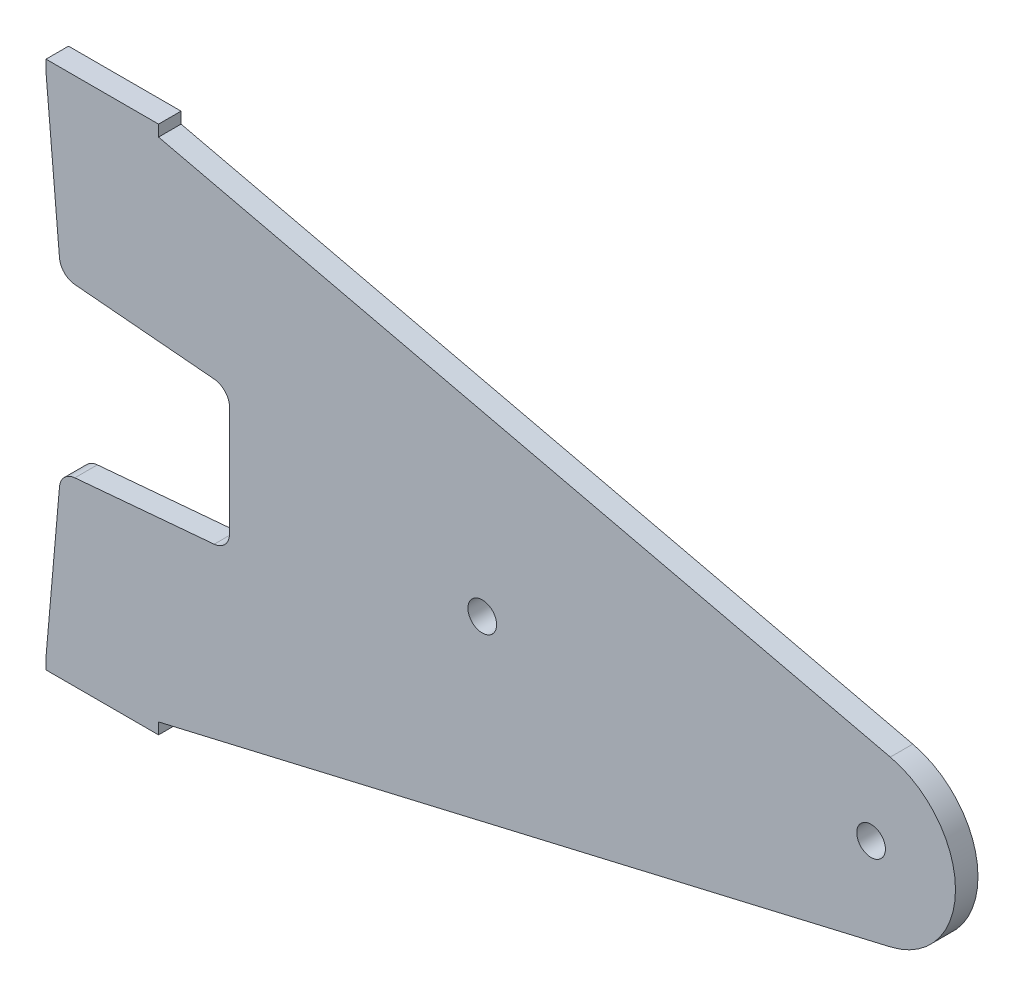
ISO-10303-21;
HEADER;
FILE_DESCRIPTION(('STEP AP214'),'2;1');
FILE_NAME('part.step','',(''),(''),'','','');
FILE_SCHEMA(('AUTOMOTIVE_DESIGN { 1 0 10303 214 1 1 1 1 }'));
ENDSEC;
DATA;
#1=APPLICATION_CONTEXT('core data for automotive mechanical design processes');
#2=APPLICATION_PROTOCOL_DEFINITION('international standard','automotive_design',2000,#1);
#3=PRODUCT_CONTEXT('',#1,'mechanical');
#4=PRODUCT('Part','Part','',(#3));
#5=PRODUCT_RELATED_PRODUCT_CATEGORY('part','',(#4));
#6=PRODUCT_DEFINITION_FORMATION('','',#4);
#7=PRODUCT_DEFINITION_CONTEXT('part definition',#1,'design');
#8=PRODUCT_DEFINITION('design','',#6,#7);
#9=PRODUCT_DEFINITION_SHAPE('','',#8);
#10=(LENGTH_UNIT() NAMED_UNIT(*) SI_UNIT(.MILLI.,.METRE.));
#11=(NAMED_UNIT(*) PLANE_ANGLE_UNIT() SI_UNIT($,.RADIAN.));
#12=(NAMED_UNIT(*) SI_UNIT($,.STERADIAN.) SOLID_ANGLE_UNIT());
#13=UNCERTAINTY_MEASURE_WITH_UNIT(LENGTH_MEASURE(1.E-05),#10,'distance_accuracy_value','');
#14=(GEOMETRIC_REPRESENTATION_CONTEXT(3) GLOBAL_UNCERTAINTY_ASSIGNED_CONTEXT((#13)) GLOBAL_UNIT_ASSIGNED_CONTEXT((#10,
#11,#12)) REPRESENTATION_CONTEXT('',''));
#15=CARTESIAN_POINT('',(0.,0.,0.));
#16=DIRECTION('',(0.,0.,1.));
#17=DIRECTION('',(1.,0.,0.));
#18=AXIS2_PLACEMENT_3D('',#15,#16,#17);
#19=CARTESIAN_POINT('',(159.09516778292,0.,4.));
#20=DIRECTION('',(0.,0.,-1.));
#21=DIRECTION('',(-1.,0.,0.));
#22=AXIS2_PLACEMENT_3D('',#19,#20,#21);
#23=PLANE('',#22);
#24=CARTESIAN_POINT('',(159.09516778292,0.,4.));
#25=DIRECTION('',(0.,0.,1.));
#26=DIRECTION('',(1.,0.,0.));
#27=AXIS2_PLACEMENT_3D('',#24,#25,#26);
#28=CIRCLE('',#27,2.54999999999999);
#29=CARTESIAN_POINT('',(161.64516778292,0.,4.));
#30=VERTEX_POINT('',#29);
#31=EDGE_CURVE('E198',#30,#30,#28,.T.);
#32=ORIENTED_EDGE('',*,*,#31,.F.);
#33=EDGE_LOOP('',(#32));
#34=FACE_BOUND('',#33,.T.);
#35=DIRECTION('',(0.,-1.,0.));
#36=VECTOR('',#35,1.);
#37=CARTESIAN_POINT('',(12.4746193717496,45.0087166950281,4.));
#38=LINE('',#37,#36);
#39=CARTESIAN_POINT('',(12.4746193717496,47.,4.));
#40=VERTEX_POINT('',#39);
#41=CARTESIAN_POINT('',(12.4746193717496,45.0087166950281,4.));
#42=VERTEX_POINT('',#41);
#43=EDGE_CURVE('E230',#40,#42,#38,.T.);
#44=ORIENTED_EDGE('',*,*,#43,.T.);
#45=DIRECTION('',(0.0871669502809188,-0.996193717496112,0.));
#46=VECTOR('',#45,1.);
#47=CARTESIAN_POINT('',(12.7062507581159,42.3615008508427,4.));
#48=LINE('',#47,#46);
#49=CARTESIAN_POINT('',(14.8728851091224,17.599965410768,4.));
#50=VERTEX_POINT('',#49);
#51=EDGE_CURVE('E127',#42,#50,#48,.T.);
#52=ORIENTED_EDGE('',*,*,#51,.T.);
#53=CARTESIAN_POINT('',(17.8614662616107,17.8614662616107,4.));
#54=DIRECTION('',(0.,0.,1.));
#55=DIRECTION('',(1.,0.,0.));
#56=AXIS2_PLACEMENT_3D('',#53,#54,#55);
#57=CIRCLE('',#56,3.);
#58=CARTESIAN_POINT('',(17.599965410768,14.8728851091224,4.));
#59=VERTEX_POINT('',#58);
#60=EDGE_CURVE('E275',#50,#59,#57,.T.);
#61=ORIENTED_EDGE('',*,*,#60,.T.);
#62=DIRECTION('',(0.996193717496113,-0.0871669502809097,0.));
#63=VECTOR('',#62,1.);
#64=CARTESIAN_POINT('',(17.599965410768,14.8728851091224,4.));
#65=LINE('',#64,#63);
#66=CARTESIAN_POINT('',(42.3615008508427,12.7062507581158,4.));
#67=VERTEX_POINT('',#66);
#68=EDGE_CURVE('E294',#59,#67,#65,.T.);
#69=ORIENTED_EDGE('',*,*,#68,.T.);
#70=CARTESIAN_POINT('',(42.1,9.71766960562749,4.));
#71=DIRECTION('',(0.,0.,-1.));
#72=DIRECTION('',(-1.,0.,0.));
#73=AXIS2_PLACEMENT_3D('',#70,#71,#72);
#74=CIRCLE('',#73,3.);
#75=CARTESIAN_POINT('',(45.1,9.71766960562747,4.));
#76=VERTEX_POINT('',#75);
#77=EDGE_CURVE('E291',#67,#76,#74,.T.);
#78=ORIENTED_EDGE('',*,*,#77,.T.);
#79=DIRECTION('',(0.,-1.,0.));
#80=VECTOR('',#79,1.);
#81=CARTESIAN_POINT('',(45.1,-9.71766960562747,4.));
#82=LINE('',#81,#80);
#83=CARTESIAN_POINT('',(45.1,-9.71766960562747,4.));
#84=VERTEX_POINT('',#83);
#85=EDGE_CURVE('E293',#76,#84,#82,.T.);
#86=ORIENTED_EDGE('',*,*,#85,.T.);
#87=CARTESIAN_POINT('',(42.1,-9.71766960562749,4.));
#88=DIRECTION('',(0.,0.,-1.));
#89=DIRECTION('',(1.,0.,0.));
#90=AXIS2_PLACEMENT_3D('',#87,#88,#89);
#91=CIRCLE('',#90,3.);
#92=CARTESIAN_POINT('',(42.3615008508427,-12.7062507581158,4.));
#93=VERTEX_POINT('',#92);
#94=EDGE_CURVE('E296',#84,#93,#91,.T.);
#95=ORIENTED_EDGE('',*,*,#94,.T.);
#96=DIRECTION('',(-0.996193717496113,-0.0871669502809097,0.));
#97=VECTOR('',#96,1.);
#98=CARTESIAN_POINT('',(17.599965410768,-14.8728851091224,4.));
#99=LINE('',#98,#97);
#100=CARTESIAN_POINT('',(17.599965410768,-14.8728851091224,4.));
#101=VERTEX_POINT('',#100);
#102=EDGE_CURVE('E302',#93,#101,#99,.T.);
#103=ORIENTED_EDGE('',*,*,#102,.T.);
#104=CARTESIAN_POINT('',(17.8614662616107,-17.8614662616107,4.));
#105=DIRECTION('',(0.,0.,1.));
#106=DIRECTION('',(-1.,0.,0.));
#107=AXIS2_PLACEMENT_3D('',#104,#105,#106);
#108=CIRCLE('',#107,3.);
#109=CARTESIAN_POINT('',(14.8728851091224,-17.599965410768,4.));
#110=VERTEX_POINT('',#109);
#111=EDGE_CURVE('E304',#101,#110,#108,.T.);
#112=ORIENTED_EDGE('',*,*,#111,.T.);
#113=DIRECTION('',(-0.0871669502809082,-0.996193717496113,0.));
#114=VECTOR('',#113,1.);
#115=CARTESIAN_POINT('',(14.8728851091224,-17.599965410768,4.));
#116=LINE('',#115,#114);
#117=CARTESIAN_POINT('',(12.4746193717496,-45.0087166950281,4.));
#118=VERTEX_POINT('',#117);
#119=EDGE_CURVE('E306',#110,#118,#116,.T.);
#120=ORIENTED_EDGE('',*,*,#119,.T.);
#121=DIRECTION('',(0.,-1.,0.));
#122=VECTOR('',#121,1.);
#123=CARTESIAN_POINT('',(12.4746193717496,-45.0087166950281,4.));
#124=LINE('',#123,#122);
#125=CARTESIAN_POINT('',(12.4746193717496,-47.,4.));
#126=VERTEX_POINT('',#125);
#127=EDGE_CURVE('E308',#118,#126,#124,.T.);
#128=ORIENTED_EDGE('',*,*,#127,.T.);
#129=DIRECTION('',(1.,0.,0.));
#130=VECTOR('',#129,1.);
#131=CARTESIAN_POINT('',(12.4746193717496,-47.,4.));
#132=LINE('',#131,#130);
#133=CARTESIAN_POINT('',(32.4746193717497,-47.,4.));
#134=VERTEX_POINT('',#133);
#135=EDGE_CURVE('E310',#126,#134,#132,.T.);
#136=ORIENTED_EDGE('',*,*,#135,.T.);
#137=DIRECTION('',(0.,1.,0.));
#138=VECTOR('',#137,1.);
#139=CARTESIAN_POINT('',(32.4746193717497,-47.,4.));
#140=LINE('',#139,#138);
#141=CARTESIAN_POINT('',(32.4746193717497,-45.,4.));
#142=VERTEX_POINT('',#141);
#143=EDGE_CURVE('E312',#134,#142,#140,.T.);
#144=ORIENTED_EDGE('',*,*,#143,.T.);
#145=DIRECTION('',(0.973754498982734,0.227600913247036,0.));
#146=VECTOR('',#145,1.);
#147=CARTESIAN_POINT('',(32.4746193717497,-45.,4.));
#148=LINE('',#147,#146);
#149=CARTESIAN_POINT('',(162.509181481625,-14.6063174847412,4.));
#150=VERTEX_POINT('',#149);
#151=EDGE_CURVE('E314',#142,#150,#148,.T.);
#152=ORIENTED_EDGE('',*,*,#151,.T.);
#153=CARTESIAN_POINT('',(159.09516778292,0.,4.));
#154=DIRECTION('',(0.,0.,1.));
#155=DIRECTION('',(-1.,0.,0.));
#156=AXIS2_PLACEMENT_3D('',#153,#154,#155);
#157=CIRCLE('',#156,15.);
#158=CARTESIAN_POINT('',(162.509181481625,14.6063174847412,4.));
#159=VERTEX_POINT('',#158);
#160=EDGE_CURVE('E176',#150,#159,#157,.T.);
#161=ORIENTED_EDGE('',*,*,#160,.T.);
#162=DIRECTION('',(-0.973754498982734,0.227600913247036,0.));
#163=VECTOR('',#162,1.);
#164=CARTESIAN_POINT('',(32.4746193717497,45.,4.));
#165=LINE('',#164,#163);
#166=CARTESIAN_POINT('',(32.4746193717497,45.,4.));
#167=VERTEX_POINT('',#166);
#168=EDGE_CURVE('E170',#159,#167,#165,.T.);
#169=ORIENTED_EDGE('',*,*,#168,.T.);
#170=DIRECTION('',(0.,1.,0.));
#171=VECTOR('',#170,1.);
#172=CARTESIAN_POINT('',(32.4746193717497,47.,4.));
#173=LINE('',#172,#171);
#174=CARTESIAN_POINT('',(32.4746193717497,47.,4.));
#175=VERTEX_POINT('',#174);
#176=EDGE_CURVE('E174',#167,#175,#173,.T.);
#177=ORIENTED_EDGE('',*,*,#176,.T.);
#178=DIRECTION('',(-1.,0.,0.));
#179=VECTOR('',#178,1.);
#180=CARTESIAN_POINT('',(12.4746193717496,47.,4.));
#181=LINE('',#180,#179);
#182=EDGE_CURVE('E54',#175,#40,#181,.T.);
#183=ORIENTED_EDGE('',*,*,#182,.T.);
#184=EDGE_LOOP('',(#44,#52,#61,#69,#78,#86,#95,#103,#112,#120,#128,#136,#144,#152,#161,#169,
#177,#183));
#185=FACE_BOUND('',#184,.T.);
#186=CARTESIAN_POINT('',(90.,0.,4.));
#187=DIRECTION('',(0.,0.,1.));
#188=DIRECTION('',(1.,0.,0.));
#189=AXIS2_PLACEMENT_3D('',#186,#187,#188);
#190=CIRCLE('',#189,2.54999999999999);
#191=CARTESIAN_POINT('',(92.55,0.,4.));
#192=VERTEX_POINT('',#191);
#193=EDGE_CURVE('E357',#192,#192,#190,.T.);
#194=ORIENTED_EDGE('',*,*,#193,.F.);
#195=EDGE_LOOP('',(#194));
#196=FACE_BOUND('',#195,.T.);
#197=ADVANCED_FACE('F37',(#34,#185,#196),#23,.F.);
#198=CARTESIAN_POINT('',(159.09516778292,0.,0.));
#199=DIRECTION('',(0.,0.,-1.));
#200=DIRECTION('',(-1.,0.,0.));
#201=AXIS2_PLACEMENT_3D('',#198,#199,#200);
#202=PLANE('',#201);
#203=CARTESIAN_POINT('',(159.09516778292,0.,0.));
#204=DIRECTION('',(0.,0.,1.));
#205=DIRECTION('',(1.,0.,0.));
#206=AXIS2_PLACEMENT_3D('',#203,#204,#205);
#207=CIRCLE('',#206,2.54999999999999);
#208=CARTESIAN_POINT('',(161.64516778292,0.,0.));
#209=VERTEX_POINT('',#208);
#210=EDGE_CURVE('E362',#209,#209,#207,.T.);
#211=ORIENTED_EDGE('',*,*,#210,.T.);
#212=EDGE_LOOP('',(#211));
#213=FACE_BOUND('',#212,.T.);
#214=DIRECTION('',(0.,-1.,0.));
#215=VECTOR('',#214,1.);
#216=CARTESIAN_POINT('',(12.4746193717496,45.0087166950281,0.));
#217=LINE('',#216,#215);
#218=CARTESIAN_POINT('',(12.4746193717496,47.,0.));
#219=VERTEX_POINT('',#218);
#220=CARTESIAN_POINT('',(12.4746193717496,45.0087166950281,0.));
#221=VERTEX_POINT('',#220);
#222=EDGE_CURVE('E194',#219,#221,#217,.T.);
#223=ORIENTED_EDGE('',*,*,#222,.F.);
#224=DIRECTION('',(-1.,0.,0.));
#225=VECTOR('',#224,1.);
#226=CARTESIAN_POINT('',(12.4746193717496,47.,0.));
#227=LINE('',#226,#225);
#228=CARTESIAN_POINT('',(32.4746193717497,47.,0.));
#229=VERTEX_POINT('',#228);
#230=EDGE_CURVE('E119',#229,#219,#227,.T.);
#231=ORIENTED_EDGE('',*,*,#230,.F.);
#232=DIRECTION('',(0.,1.,0.));
#233=VECTOR('',#232,1.);
#234=CARTESIAN_POINT('',(32.4746193717497,47.,0.));
#235=LINE('',#234,#233);
#236=CARTESIAN_POINT('',(32.4746193717497,45.,0.));
#237=VERTEX_POINT('',#236);
#238=EDGE_CURVE('E113',#237,#229,#235,.T.);
#239=ORIENTED_EDGE('',*,*,#238,.F.);
#240=DIRECTION('',(-0.973754498982734,0.227600913247036,0.));
#241=VECTOR('',#240,1.);
#242=CARTESIAN_POINT('',(32.4746193717497,45.,0.));
#243=LINE('',#242,#241);
#244=CARTESIAN_POINT('',(162.509181481625,14.6063174847412,0.));
#245=VERTEX_POINT('',#244);
#246=EDGE_CURVE('E184',#245,#237,#243,.T.);
#247=ORIENTED_EDGE('',*,*,#246,.F.);
#248=CARTESIAN_POINT('',(159.09516778292,0.,0.));
#249=DIRECTION('',(0.,0.,1.));
#250=DIRECTION('',(-1.,0.,0.));
#251=AXIS2_PLACEMENT_3D('',#248,#249,#250);
#252=CIRCLE('',#251,15.);
#253=CARTESIAN_POINT('',(162.509181481625,-14.6063174847412,0.));
#254=VERTEX_POINT('',#253);
#255=EDGE_CURVE('E225',#254,#245,#252,.T.);
#256=ORIENTED_EDGE('',*,*,#255,.F.);
#257=DIRECTION('',(0.973754498982734,0.227600913247036,0.));
#258=VECTOR('',#257,1.);
#259=CARTESIAN_POINT('',(32.4746193717497,-45.,0.));
#260=LINE('',#259,#258);
#261=CARTESIAN_POINT('',(32.4746193717497,-45.,0.));
#262=VERTEX_POINT('',#261);
#263=EDGE_CURVE('E223',#262,#254,#260,.T.);
#264=ORIENTED_EDGE('',*,*,#263,.F.);
#265=DIRECTION('',(0.,1.,0.));
#266=VECTOR('',#265,1.);
#267=CARTESIAN_POINT('',(32.4746193717497,-47.,0.));
#268=LINE('',#267,#266);
#269=CARTESIAN_POINT('',(32.4746193717497,-47.,0.));
#270=VERTEX_POINT('',#269);
#271=EDGE_CURVE('E221',#270,#262,#268,.T.);
#272=ORIENTED_EDGE('',*,*,#271,.F.);
#273=DIRECTION('',(1.,0.,0.));
#274=VECTOR('',#273,1.);
#275=CARTESIAN_POINT('',(12.4746193717496,-47.,0.));
#276=LINE('',#275,#274);
#277=CARTESIAN_POINT('',(12.4746193717496,-47.,0.));
#278=VERTEX_POINT('',#277);
#279=EDGE_CURVE('E219',#278,#270,#276,.T.);
#280=ORIENTED_EDGE('',*,*,#279,.F.);
#281=DIRECTION('',(0.,-1.,0.));
#282=VECTOR('',#281,1.);
#283=CARTESIAN_POINT('',(12.4746193717496,-45.0087166950281,0.));
#284=LINE('',#283,#282);
#285=CARTESIAN_POINT('',(12.4746193717496,-45.0087166950281,0.));
#286=VERTEX_POINT('',#285);
#287=EDGE_CURVE('E217',#286,#278,#284,.T.);
#288=ORIENTED_EDGE('',*,*,#287,.F.);
#289=DIRECTION('',(-0.0871669502809188,-0.996193717496112,0.));
#290=VECTOR('',#289,1.);
#291=CARTESIAN_POINT('',(12.7062507581159,-42.3615008508427,0.));
#292=LINE('',#291,#290);
#293=CARTESIAN_POINT('',(14.8728851091224,-17.599965410768,0.));
#294=VERTEX_POINT('',#293);
#295=EDGE_CURVE('E215',#294,#286,#292,.T.);
#296=ORIENTED_EDGE('',*,*,#295,.F.);
#297=CARTESIAN_POINT('',(17.8614662616107,-17.8614662616107,0.));
#298=DIRECTION('',(0.,0.,1.));
#299=DIRECTION('',(-1.,0.,0.));
#300=AXIS2_PLACEMENT_3D('',#297,#298,#299);
#301=CIRCLE('',#300,3.);
#302=CARTESIAN_POINT('',(17.599965410768,-14.8728851091224,0.));
#303=VERTEX_POINT('',#302);
#304=EDGE_CURVE('E212',#303,#294,#301,.T.);
#305=ORIENTED_EDGE('',*,*,#304,.F.);
#306=DIRECTION('',(-0.996193717496113,-0.0871669502809097,0.));
#307=VECTOR('',#306,1.);
#308=CARTESIAN_POINT('',(17.599965410768,-14.8728851091224,0.));
#309=LINE('',#308,#307);
#310=CARTESIAN_POINT('',(42.3615008508427,-12.7062507581158,0.));
#311=VERTEX_POINT('',#310);
#312=EDGE_CURVE('E210',#311,#303,#309,.T.);
#313=ORIENTED_EDGE('',*,*,#312,.F.);
#314=CARTESIAN_POINT('',(42.1,-9.71766960562749,0.));
#315=DIRECTION('',(0.,0.,-1.));
#316=DIRECTION('',(1.,0.,0.));
#317=AXIS2_PLACEMENT_3D('',#314,#315,#316);
#318=CIRCLE('',#317,3.);
#319=CARTESIAN_POINT('',(45.1,-9.71766960562747,0.));
#320=VERTEX_POINT('',#319);
#321=EDGE_CURVE('E208',#320,#311,#318,.T.);
#322=ORIENTED_EDGE('',*,*,#321,.F.);
#323=DIRECTION('',(0.,-1.,0.));
#324=VECTOR('',#323,1.);
#325=CARTESIAN_POINT('',(45.1,-9.71766960562747,0.));
#326=LINE('',#325,#324);
#327=CARTESIAN_POINT('',(45.1,9.71766960562747,0.));
#328=VERTEX_POINT('',#327);
#329=EDGE_CURVE('E206',#328,#320,#326,.T.);
#330=ORIENTED_EDGE('',*,*,#329,.F.);
#331=CARTESIAN_POINT('',(42.1,9.71766960562749,0.));
#332=DIRECTION('',(0.,0.,-1.));
#333=DIRECTION('',(-1.,0.,0.));
#334=AXIS2_PLACEMENT_3D('',#331,#332,#333);
#335=CIRCLE('',#334,3.);
#336=CARTESIAN_POINT('',(42.3615008508427,12.7062507581158,0.));
#337=VERTEX_POINT('',#336);
#338=EDGE_CURVE('E204',#337,#328,#335,.T.);
#339=ORIENTED_EDGE('',*,*,#338,.F.);
#340=DIRECTION('',(0.996193717496113,-0.0871669502809097,0.));
#341=VECTOR('',#340,1.);
#342=CARTESIAN_POINT('',(17.599965410768,14.8728851091224,0.));
#343=LINE('',#342,#341);
#344=CARTESIAN_POINT('',(17.599965410768,14.8728851091224,0.));
#345=VERTEX_POINT('',#344);
#346=EDGE_CURVE('E202',#345,#337,#343,.T.);
#347=ORIENTED_EDGE('',*,*,#346,.F.);
#348=CARTESIAN_POINT('',(17.8614662616107,17.8614662616107,0.));
#349=DIRECTION('',(0.,0.,1.));
#350=DIRECTION('',(1.,0.,0.));
#351=AXIS2_PLACEMENT_3D('',#348,#349,#350);
#352=CIRCLE('',#351,3.);
#353=CARTESIAN_POINT('',(14.8728851091224,17.599965410768,0.));
#354=VERTEX_POINT('',#353);
#355=EDGE_CURVE('E200',#354,#345,#352,.T.);
#356=ORIENTED_EDGE('',*,*,#355,.F.);
#357=DIRECTION('',(0.0871669502809082,-0.996193717496113,0.));
#358=VECTOR('',#357,1.);
#359=CARTESIAN_POINT('',(14.8728851091224,17.599965410768,0.));
#360=LINE('',#359,#358);
#361=EDGE_CURVE('E197',#221,#354,#360,.T.);
#362=ORIENTED_EDGE('',*,*,#361,.F.);
#363=EDGE_LOOP('',(#223,#231,#239,#247,#256,#264,#272,#280,#288,#296,#305,#313,#322,#330,#339,
#347,#356,#362));
#364=FACE_BOUND('',#363,.T.);
#365=CARTESIAN_POINT('',(90.,0.,0.));
#366=DIRECTION('',(0.,0.,1.));
#367=DIRECTION('',(1.,0.,0.));
#368=AXIS2_PLACEMENT_3D('',#365,#366,#367);
#369=CIRCLE('',#368,2.54999999999999);
#370=CARTESIAN_POINT('',(92.55,0.,0.));
#371=VERTEX_POINT('',#370);
#372=EDGE_CURVE('E360',#371,#371,#369,.T.);
#373=ORIENTED_EDGE('',*,*,#372,.T.);
#374=EDGE_LOOP('',(#373));
#375=FACE_BOUND('',#374,.T.);
#376=ADVANCED_FACE('F279',(#213,#364,#375),#202,.T.);
#377=CARTESIAN_POINT('',(12.4746193717496,45.0087166950281,4.));
#378=DIRECTION('',(1.,0.,0.));
#379=DIRECTION('',(0.,1.,0.));
#380=AXIS2_PLACEMENT_3D('',#377,#378,#379);
#381=PLANE('',#380);
#382=ORIENTED_EDGE('',*,*,#222,.T.);
#383=DIRECTION('',(0.,0.,-1.));
#384=VECTOR('',#383,1.);
#385=CARTESIAN_POINT('',(12.4746193717496,45.0087166950281,4.));
#386=LINE('',#385,#384);
#387=EDGE_CURVE('E11',#42,#221,#386,.T.);
#388=ORIENTED_EDGE('',*,*,#387,.F.);
#389=ORIENTED_EDGE('',*,*,#43,.F.);
#390=DIRECTION('',(0.,0.,-1.));
#391=VECTOR('',#390,1.);
#392=CARTESIAN_POINT('',(12.4746193717496,47.,4.));
#393=LINE('',#392,#391);
#394=EDGE_CURVE('E190',#40,#219,#393,.T.);
#395=ORIENTED_EDGE('',*,*,#394,.T.);
#396=EDGE_LOOP('',(#382,#388,#389,#395));
#397=FACE_BOUND('',#396,.T.);
#398=ADVANCED_FACE('F39',(#397),#381,.F.);
#399=CARTESIAN_POINT('',(14.8728851091224,17.599965410768,4.));
#400=DIRECTION('',(0.996193717496113,0.0871669502809082,0.));
#401=DIRECTION('',(-0.0871669502809082,0.996193717496113,0.));
#402=AXIS2_PLACEMENT_3D('',#399,#400,#401);
#403=PLANE('',#402);
#404=ORIENTED_EDGE('',*,*,#361,.T.);
#405=DIRECTION('',(0.,0.,-1.));
#406=VECTOR('',#405,1.);
#407=CARTESIAN_POINT('',(14.8728851091224,17.599965410768,4.));
#408=LINE('',#407,#406);
#409=EDGE_CURVE('E46',#50,#354,#408,.T.);
#410=ORIENTED_EDGE('',*,*,#409,.F.);
#411=ORIENTED_EDGE('',*,*,#51,.F.);
#412=ORIENTED_EDGE('',*,*,#387,.T.);
#413=EDGE_LOOP('',(#404,#410,#411,#412));
#414=FACE_BOUND('',#413,.T.);
#415=ADVANCED_FACE('F516',(#414),#403,.F.);
#416=CARTESIAN_POINT('',(17.8614662616107,17.8614662616107,4.));
#417=DIRECTION('',(0.,0.,-1.));
#418=DIRECTION('',(-1.,0.,0.));
#419=AXIS2_PLACEMENT_3D('',#416,#417,#418);
#420=CYLINDRICAL_SURFACE('',#419,3.);
#421=ORIENTED_EDGE('',*,*,#355,.T.);
#422=DIRECTION('',(0.,0.,-1.));
#423=VECTOR('',#422,1.);
#424=CARTESIAN_POINT('',(17.599965410768,14.8728851091224,4.));
#425=LINE('',#424,#423);
#426=EDGE_CURVE('E267',#59,#345,#425,.T.);
#427=ORIENTED_EDGE('',*,*,#426,.F.);
#428=ORIENTED_EDGE('',*,*,#60,.F.);
#429=ORIENTED_EDGE('',*,*,#409,.T.);
#430=EDGE_LOOP('',(#421,#427,#428,#429));
#431=FACE_BOUND('',#430,.T.);
#432=ADVANCED_FACE('F273',(#431),#420,.T.);
#433=CARTESIAN_POINT('',(17.599965410768,14.8728851091224,4.));
#434=DIRECTION('',(0.0871669502809097,0.996193717496113,0.));
#435=DIRECTION('',(-0.996193717496113,0.0871669502809097,0.));
#436=AXIS2_PLACEMENT_3D('',#433,#434,#435);
#437=PLANE('',#436);
#438=ORIENTED_EDGE('',*,*,#346,.T.);
#439=DIRECTION('',(0.,0.,-1.));
#440=VECTOR('',#439,1.);
#441=CARTESIAN_POINT('',(42.3615008508427,12.7062507581158,4.));
#442=LINE('',#441,#440);
#443=EDGE_CURVE('E264',#67,#337,#442,.T.);
#444=ORIENTED_EDGE('',*,*,#443,.F.);
#445=ORIENTED_EDGE('',*,*,#68,.F.);
#446=ORIENTED_EDGE('',*,*,#426,.T.);
#447=EDGE_LOOP('',(#438,#444,#445,#446));
#448=FACE_BOUND('',#447,.T.);
#449=ADVANCED_FACE('F285',(#448),#437,.F.);
#450=CARTESIAN_POINT('',(42.1,9.71766960562749,4.));
#451=DIRECTION('',(0.,0.,-1.));
#452=DIRECTION('',(-1.,0.,0.));
#453=AXIS2_PLACEMENT_3D('',#450,#451,#452);
#454=CYLINDRICAL_SURFACE('',#453,3.);
#455=ORIENTED_EDGE('',*,*,#338,.T.);
#456=DIRECTION('',(0.,0.,-1.));
#457=VECTOR('',#456,1.);
#458=CARTESIAN_POINT('',(45.1,9.71766960562747,4.));
#459=LINE('',#458,#457);
#460=EDGE_CURVE('E261',#76,#328,#459,.T.);
#461=ORIENTED_EDGE('',*,*,#460,.F.);
#462=ORIENTED_EDGE('',*,*,#77,.F.);
#463=ORIENTED_EDGE('',*,*,#443,.T.);
#464=EDGE_LOOP('',(#455,#461,#462,#463));
#465=FACE_BOUND('',#464,.T.);
#466=ADVANCED_FACE('F289',(#465),#454,.F.);
#467=CARTESIAN_POINT('',(45.1,-9.71766960562747,4.));
#468=DIRECTION('',(1.,0.,0.));
#469=DIRECTION('',(0.,0.,-1.));
#470=AXIS2_PLACEMENT_3D('',#467,#468,#469);
#471=PLANE('',#470);
#472=ORIENTED_EDGE('',*,*,#329,.T.);
#473=DIRECTION('',(0.,0.,-1.));
#474=VECTOR('',#473,1.);
#475=CARTESIAN_POINT('',(45.1,-9.71766960562747,4.));
#476=LINE('',#475,#474);
#477=EDGE_CURVE('E258',#84,#320,#476,.T.);
#478=ORIENTED_EDGE('',*,*,#477,.F.);
#479=ORIENTED_EDGE('',*,*,#85,.F.);
#480=ORIENTED_EDGE('',*,*,#460,.T.);
#481=EDGE_LOOP('',(#472,#478,#479,#480));
#482=FACE_BOUND('',#481,.T.);
#483=ADVANCED_FACE('F481',(#482),#471,.F.);
#484=CARTESIAN_POINT('',(42.1,-9.71766960562749,4.));
#485=DIRECTION('',(0.,0.,-1.));
#486=DIRECTION('',(-1.,0.,0.));
#487=AXIS2_PLACEMENT_3D('',#484,#485,#486);
#488=CYLINDRICAL_SURFACE('',#487,3.);
#489=ORIENTED_EDGE('',*,*,#321,.T.);
#490=DIRECTION('',(0.,0.,-1.));
#491=VECTOR('',#490,1.);
#492=CARTESIAN_POINT('',(42.3615008508427,-12.7062507581158,4.));
#493=LINE('',#492,#491);
#494=EDGE_CURVE('E255',#93,#311,#493,.T.);
#495=ORIENTED_EDGE('',*,*,#494,.F.);
#496=ORIENTED_EDGE('',*,*,#94,.F.);
#497=ORIENTED_EDGE('',*,*,#477,.T.);
#498=EDGE_LOOP('',(#489,#495,#496,#497));
#499=FACE_BOUND('',#498,.T.);
#500=ADVANCED_FACE('F471',(#499),#488,.F.);
#501=CARTESIAN_POINT('',(17.599965410768,-14.8728851091224,4.));
#502=DIRECTION('',(0.0871669502809097,-0.996193717496113,0.));
#503=DIRECTION('',(0.996193717496113,0.0871669502809097,0.));
#504=AXIS2_PLACEMENT_3D('',#501,#502,#503);
#505=PLANE('',#504);
#506=ORIENTED_EDGE('',*,*,#312,.T.);
#507=DIRECTION('',(0.,0.,-1.));
#508=VECTOR('',#507,1.);
#509=CARTESIAN_POINT('',(17.599965410768,-14.8728851091224,4.));
#510=LINE('',#509,#508);
#511=EDGE_CURVE('E252',#101,#303,#510,.T.);
#512=ORIENTED_EDGE('',*,*,#511,.F.);
#513=ORIENTED_EDGE('',*,*,#102,.F.);
#514=ORIENTED_EDGE('',*,*,#494,.T.);
#515=EDGE_LOOP('',(#506,#512,#513,#514));
#516=FACE_BOUND('',#515,.T.);
#517=ADVANCED_FACE('F461',(#516),#505,.F.);
#518=CARTESIAN_POINT('',(17.8614662616107,-17.8614662616107,4.));
#519=DIRECTION('',(0.,0.,-1.));
#520=DIRECTION('',(-1.,0.,0.));
#521=AXIS2_PLACEMENT_3D('',#518,#519,#520);
#522=CYLINDRICAL_SURFACE('',#521,3.);
#523=ORIENTED_EDGE('',*,*,#304,.T.);
#524=DIRECTION('',(0.,0.,-1.));
#525=VECTOR('',#524,1.);
#526=CARTESIAN_POINT('',(14.8728851091224,-17.599965410768,4.));
#527=LINE('',#526,#525);
#528=EDGE_CURVE('E249',#110,#294,#527,.T.);
#529=ORIENTED_EDGE('',*,*,#528,.F.);
#530=ORIENTED_EDGE('',*,*,#111,.F.);
#531=ORIENTED_EDGE('',*,*,#511,.T.);
#532=EDGE_LOOP('',(#523,#529,#530,#531));
#533=FACE_BOUND('',#532,.T.);
#534=ADVANCED_FACE('F450',(#533),#522,.T.);
#535=CARTESIAN_POINT('',(12.7062507581159,-42.3615008508427,4.));
#536=DIRECTION('',(0.996193717496112,-0.0871669502809188,0.));
#537=DIRECTION('',(0.0871669502809188,0.996193717496112,0.));
#538=AXIS2_PLACEMENT_3D('',#535,#536,#537);
#539=PLANE('',#538);
#540=ORIENTED_EDGE('',*,*,#295,.T.);
#541=DIRECTION('',(0.,0.,-1.));
#542=VECTOR('',#541,1.);
#543=CARTESIAN_POINT('',(12.4746193717496,-45.0087166950281,4.));
#544=LINE('',#543,#542);
#545=EDGE_CURVE('E246',#118,#286,#544,.T.);
#546=ORIENTED_EDGE('',*,*,#545,.F.);
#547=ORIENTED_EDGE('',*,*,#119,.F.);
#548=ORIENTED_EDGE('',*,*,#528,.T.);
#549=EDGE_LOOP('',(#540,#546,#547,#548));
#550=FACE_BOUND('',#549,.T.);
#551=ADVANCED_FACE('F440',(#550),#539,.F.);
#552=CARTESIAN_POINT('',(12.4746193717496,-45.0087166950281,4.));
#553=DIRECTION('',(1.,0.,0.));
#554=DIRECTION('',(0.,1.,0.));
#555=AXIS2_PLACEMENT_3D('',#552,#553,#554);
#556=PLANE('',#555);
#557=ORIENTED_EDGE('',*,*,#287,.T.);
#558=DIRECTION('',(0.,0.,-1.));
#559=VECTOR('',#558,1.);
#560=CARTESIAN_POINT('',(12.4746193717496,-47.,4.));
#561=LINE('',#560,#559);
#562=EDGE_CURVE('E243',#126,#278,#561,.T.);
#563=ORIENTED_EDGE('',*,*,#562,.F.);
#564=ORIENTED_EDGE('',*,*,#127,.F.);
#565=ORIENTED_EDGE('',*,*,#545,.T.);
#566=EDGE_LOOP('',(#557,#563,#564,#565));
#567=FACE_BOUND('',#566,.T.);
#568=ADVANCED_FACE('F430',(#567),#556,.F.);
#569=CARTESIAN_POINT('',(12.4746193717496,-47.,4.));
#570=DIRECTION('',(0.,1.,0.));
#571=DIRECTION('',(-1.,0.,0.));
#572=AXIS2_PLACEMENT_3D('',#569,#570,#571);
#573=PLANE('',#572);
#574=ORIENTED_EDGE('',*,*,#279,.T.);
#575=DIRECTION('',(0.,0.,-1.));
#576=VECTOR('',#575,1.);
#577=CARTESIAN_POINT('',(32.4746193717497,-47.,4.));
#578=LINE('',#577,#576);
#579=EDGE_CURVE('E240',#134,#270,#578,.T.);
#580=ORIENTED_EDGE('',*,*,#579,.F.);
#581=ORIENTED_EDGE('',*,*,#135,.F.);
#582=ORIENTED_EDGE('',*,*,#562,.T.);
#583=EDGE_LOOP('',(#574,#580,#581,#582));
#584=FACE_BOUND('',#583,.T.);
#585=ADVANCED_FACE('F420',(#584),#573,.F.);
#586=CARTESIAN_POINT('',(32.4746193717497,-47.,4.));
#587=DIRECTION('',(-1.,0.,0.));
#588=DIRECTION('',(0.,0.,1.));
#589=AXIS2_PLACEMENT_3D('',#586,#587,#588);
#590=PLANE('',#589);
#591=ORIENTED_EDGE('',*,*,#271,.T.);
#592=DIRECTION('',(0.,0.,-1.));
#593=VECTOR('',#592,1.);
#594=CARTESIAN_POINT('',(32.4746193717497,-45.,4.));
#595=LINE('',#594,#593);
#596=EDGE_CURVE('E237',#142,#262,#595,.T.);
#597=ORIENTED_EDGE('',*,*,#596,.F.);
#598=ORIENTED_EDGE('',*,*,#143,.F.);
#599=ORIENTED_EDGE('',*,*,#579,.T.);
#600=EDGE_LOOP('',(#591,#597,#598,#599));
#601=FACE_BOUND('',#600,.T.);
#602=ADVANCED_FACE('F411',(#601),#590,.F.);
#603=CARTESIAN_POINT('',(32.4746193717497,-45.,4.));
#604=DIRECTION('',(-0.227600913247036,0.973754498982734,0.));
#605=DIRECTION('',(-0.973754498982734,-0.227600913247036,0.));
#606=AXIS2_PLACEMENT_3D('',#603,#604,#605);
#607=PLANE('',#606);
#608=ORIENTED_EDGE('',*,*,#263,.T.);
#609=DIRECTION('',(0.,0.,-1.));
#610=VECTOR('',#609,1.);
#611=CARTESIAN_POINT('',(162.509181481625,-14.6063174847412,4.));
#612=LINE('',#611,#610);
#613=EDGE_CURVE('E234',#150,#254,#612,.T.);
#614=ORIENTED_EDGE('',*,*,#613,.F.);
#615=ORIENTED_EDGE('',*,*,#151,.F.);
#616=ORIENTED_EDGE('',*,*,#596,.T.);
#617=EDGE_LOOP('',(#608,#614,#615,#616));
#618=FACE_BOUND('',#617,.T.);
#619=ADVANCED_FACE('F320',(#618),#607,.F.);
#620=CARTESIAN_POINT('',(159.09516778292,0.,4.));
#621=DIRECTION('',(0.,0.,-1.));
#622=DIRECTION('',(-1.,0.,0.));
#623=AXIS2_PLACEMENT_3D('',#620,#621,#622);
#624=CYLINDRICAL_SURFACE('',#623,15.);
#625=ORIENTED_EDGE('',*,*,#255,.T.);
#626=DIRECTION('',(0.,0.,-1.));
#627=VECTOR('',#626,1.);
#628=CARTESIAN_POINT('',(162.509181481625,14.6063174847412,4.));
#629=LINE('',#628,#627);
#630=EDGE_CURVE('E185',#159,#245,#629,.T.);
#631=ORIENTED_EDGE('',*,*,#630,.F.);
#632=ORIENTED_EDGE('',*,*,#160,.F.);
#633=ORIENTED_EDGE('',*,*,#613,.T.);
#634=EDGE_LOOP('',(#625,#631,#632,#633));
#635=FACE_BOUND('',#634,.T.);
#636=ADVANCED_FACE('F324',(#635),#624,.T.);
#637=CARTESIAN_POINT('',(32.4746193717497,45.,4.));
#638=DIRECTION('',(-0.227600913247036,-0.973754498982734,0.));
#639=DIRECTION('',(0.973754498982734,-0.227600913247036,0.));
#640=AXIS2_PLACEMENT_3D('',#637,#638,#639);
#641=PLANE('',#640);
#642=ORIENTED_EDGE('',*,*,#246,.T.);
#643=DIRECTION('',(0.,0.,-1.));
#644=VECTOR('',#643,1.);
#645=CARTESIAN_POINT('',(32.4746193717497,45.,4.));
#646=LINE('',#645,#644);
#647=EDGE_CURVE('E181',#167,#237,#646,.T.);
#648=ORIENTED_EDGE('',*,*,#647,.F.);
#649=ORIENTED_EDGE('',*,*,#168,.F.);
#650=ORIENTED_EDGE('',*,*,#630,.T.);
#651=EDGE_LOOP('',(#642,#648,#649,#650));
#652=FACE_BOUND('',#651,.T.);
#653=ADVANCED_FACE('F182',(#652),#641,.F.);
#654=CARTESIAN_POINT('',(32.4746193717497,47.,4.));
#655=DIRECTION('',(-1.,0.,0.));
#656=DIRECTION('',(0.,0.,1.));
#657=AXIS2_PLACEMENT_3D('',#654,#655,#656);
#658=PLANE('',#657);
#659=ORIENTED_EDGE('',*,*,#238,.T.);
#660=DIRECTION('',(0.,0.,-1.));
#661=VECTOR('',#660,1.);
#662=CARTESIAN_POINT('',(32.4746193717497,47.,4.));
#663=LINE('',#662,#661);
#664=EDGE_CURVE('E186',#175,#229,#663,.T.);
#665=ORIENTED_EDGE('',*,*,#664,.F.);
#666=ORIENTED_EDGE('',*,*,#176,.F.);
#667=ORIENTED_EDGE('',*,*,#647,.T.);
#668=EDGE_LOOP('',(#659,#665,#666,#667));
#669=FACE_BOUND('',#668,.T.);
#670=ADVANCED_FACE('F188',(#669),#658,.F.);
#671=CARTESIAN_POINT('',(12.4746193717496,47.,4.));
#672=DIRECTION('',(0.,-1.,0.));
#673=DIRECTION('',(1.,0.,0.));
#674=AXIS2_PLACEMENT_3D('',#671,#672,#673);
#675=PLANE('',#674);
#676=ORIENTED_EDGE('',*,*,#230,.T.);
#677=ORIENTED_EDGE('',*,*,#394,.F.);
#678=ORIENTED_EDGE('',*,*,#182,.F.);
#679=ORIENTED_EDGE('',*,*,#664,.T.);
#680=EDGE_LOOP('',(#676,#677,#678,#679));
#681=FACE_BOUND('',#680,.T.);
#682=ADVANCED_FACE('F328',(#681),#675,.F.);
#683=CARTESIAN_POINT('',(159.09516778292,0.,4.));
#684=DIRECTION('',(0.,0.,-1.));
#685=DIRECTION('',(-1.,0.,0.));
#686=AXIS2_PLACEMENT_3D('',#683,#684,#685);
#687=CYLINDRICAL_SURFACE('',#686,2.54999999999999);
#688=ORIENTED_EDGE('',*,*,#31,.T.);
#689=EDGE_LOOP('',(#688));
#690=FACE_BOUND('',#689,.T.);
#691=ORIENTED_EDGE('',*,*,#210,.F.);
#692=EDGE_LOOP('',(#691));
#693=FACE_BOUND('',#692,.T.);
#694=ADVANCED_FACE('F330',(#690,#693),#687,.F.);
#695=CARTESIAN_POINT('',(90.,0.,4.));
#696=DIRECTION('',(0.,0.,-1.));
#697=DIRECTION('',(-1.,0.,0.));
#698=AXIS2_PLACEMENT_3D('',#695,#696,#697);
#699=CYLINDRICAL_SURFACE('',#698,2.54999999999999);
#700=ORIENTED_EDGE('',*,*,#193,.T.);
#701=EDGE_LOOP('',(#700));
#702=FACE_BOUND('',#701,.T.);
#703=ORIENTED_EDGE('',*,*,#372,.F.);
#704=EDGE_LOOP('',(#703));
#705=FACE_BOUND('',#704,.T.);
#706=ADVANCED_FACE('F336',(#702,#705),#699,.F.);
#707=CLOSED_SHELL('',(#197,#376,#398,#415,#432,#449,#466,#483,#500,#517,#534,#551,#568,#585,
#602,#619,#636,#653,#670,#682,#694,#706));
#708=MANIFOLD_SOLID_BREP('B2',#707);
#709=ADVANCED_BREP_SHAPE_REPRESENTATION('',(#18,#708),#14);
#710=SHAPE_DEFINITION_REPRESENTATION(#9,#709);
ENDSEC;
END-ISO-10303-21;
